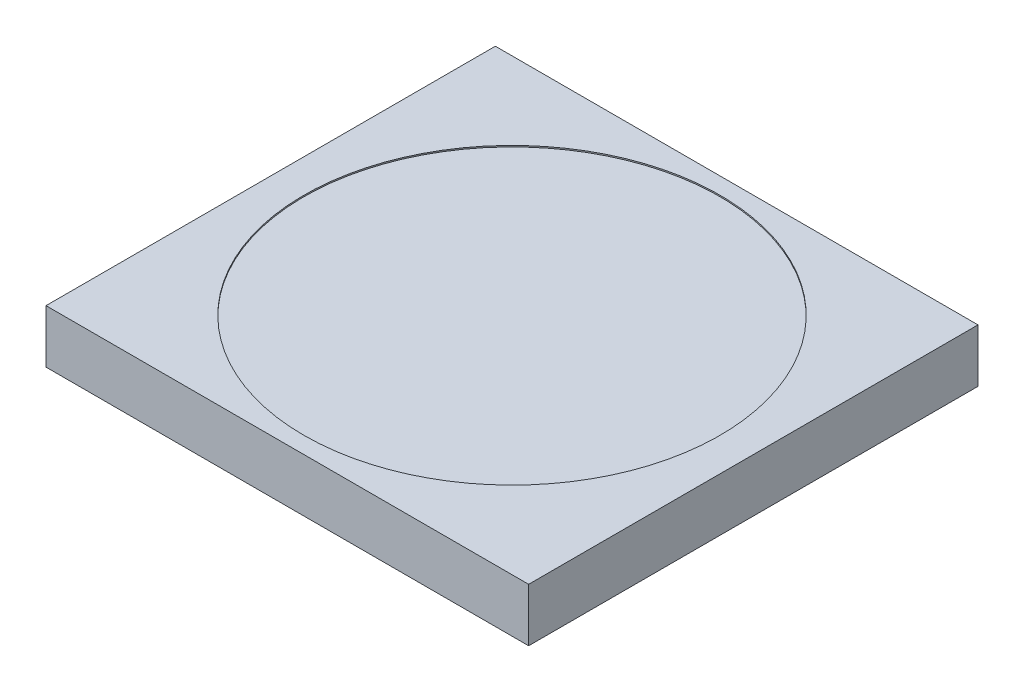
ISO-10303-21;
HEADER;
FILE_DESCRIPTION(('STEP AP214'),'2;1');
FILE_NAME('part.step','',(''),(''),'','','');
FILE_SCHEMA(('AUTOMOTIVE_DESIGN { 1 0 10303 214 1 1 1 1 }'));
ENDSEC;
DATA;
#1=APPLICATION_CONTEXT('core data for automotive mechanical design processes');
#2=APPLICATION_PROTOCOL_DEFINITION('international standard','automotive_design',2000,#1);
#3=PRODUCT_CONTEXT('',#1,'mechanical');
#4=PRODUCT('Part','Part','',(#3));
#5=PRODUCT_RELATED_PRODUCT_CATEGORY('part','',(#4));
#6=PRODUCT_DEFINITION_FORMATION('','',#4);
#7=PRODUCT_DEFINITION_CONTEXT('part definition',#1,'design');
#8=PRODUCT_DEFINITION('design','',#6,#7);
#9=PRODUCT_DEFINITION_SHAPE('','',#8);
#10=(LENGTH_UNIT() NAMED_UNIT(*) SI_UNIT(.MILLI.,.METRE.));
#11=(NAMED_UNIT(*) PLANE_ANGLE_UNIT() SI_UNIT($,.RADIAN.));
#12=(NAMED_UNIT(*) SI_UNIT($,.STERADIAN.) SOLID_ANGLE_UNIT());
#13=UNCERTAINTY_MEASURE_WITH_UNIT(LENGTH_MEASURE(1.E-05),#10,'distance_accuracy_value','');
#14=(GEOMETRIC_REPRESENTATION_CONTEXT(3) GLOBAL_UNCERTAINTY_ASSIGNED_CONTEXT((#13)) GLOBAL_UNIT_ASSIGNED_CONTEXT((#10,
#11,#12)) REPRESENTATION_CONTEXT('',''));
#15=CARTESIAN_POINT('',(0.,0.,0.));
#16=DIRECTION('',(0.,0.,1.));
#17=DIRECTION('',(1.,0.,0.));
#18=AXIS2_PLACEMENT_3D('',#15,#16,#17);
#19=CARTESIAN_POINT('',(145.,16.,-135.));
#20=DIRECTION('',(-1.,0.,0.));
#21=DIRECTION('',(0.,0.,1.));
#22=AXIS2_PLACEMENT_3D('',#19,#20,#21);
#23=PLANE('',#22);
#24=DIRECTION('',(0.,0.,-1.));
#25=VECTOR('',#24,1.);
#26=CARTESIAN_POINT('',(145.,-16.,-135.));
#27=LINE('',#26,#25);
#28=CARTESIAN_POINT('',(145.,-16.,135.));
#29=VERTEX_POINT('',#28);
#30=CARTESIAN_POINT('',(145.,-16.,-135.));
#31=VERTEX_POINT('',#30);
#32=EDGE_CURVE('E111',#29,#31,#27,.T.);
#33=ORIENTED_EDGE('',*,*,#32,.T.);
#34=DIRECTION('',(0.,-1.,0.));
#35=VECTOR('',#34,1.);
#36=CARTESIAN_POINT('',(145.,16.,-135.));
#37=LINE('',#36,#35);
#38=CARTESIAN_POINT('',(145.,16.,-135.));
#39=VERTEX_POINT('',#38);
#40=EDGE_CURVE('E11',#39,#31,#37,.T.);
#41=ORIENTED_EDGE('',*,*,#40,.F.);
#42=DIRECTION('',(0.,0.,-1.));
#43=VECTOR('',#42,1.);
#44=CARTESIAN_POINT('',(145.,16.,-135.));
#45=LINE('',#44,#43);
#46=CARTESIAN_POINT('',(145.,16.,135.));
#47=VERTEX_POINT('',#46);
#48=EDGE_CURVE('E95',#47,#39,#45,.T.);
#49=ORIENTED_EDGE('',*,*,#48,.F.);
#50=DIRECTION('',(0.,-1.,0.));
#51=VECTOR('',#50,1.);
#52=CARTESIAN_POINT('',(145.,16.,135.));
#53=LINE('',#52,#51);
#54=EDGE_CURVE('E107',#47,#29,#53,.T.);
#55=ORIENTED_EDGE('',*,*,#54,.T.);
#56=EDGE_LOOP('',(#33,#41,#49,#55));
#57=FACE_BOUND('',#56,.T.);
#58=ADVANCED_FACE('F43',(#57),#23,.F.);
#59=CARTESIAN_POINT('',(-145.,16.,-135.));
#60=DIRECTION('',(0.,0.,1.));
#61=DIRECTION('',(1.,0.,0.));
#62=AXIS2_PLACEMENT_3D('',#59,#60,#61);
#63=PLANE('',#62);
#64=DIRECTION('',(-1.,0.,0.));
#65=VECTOR('',#64,1.);
#66=CARTESIAN_POINT('',(-145.,-16.,-135.));
#67=LINE('',#66,#65);
#68=CARTESIAN_POINT('',(-145.,-16.,-135.));
#69=VERTEX_POINT('',#68);
#70=EDGE_CURVE('E100',#31,#69,#67,.T.);
#71=ORIENTED_EDGE('',*,*,#70,.T.);
#72=DIRECTION('',(0.,-1.,0.));
#73=VECTOR('',#72,1.);
#74=CARTESIAN_POINT('',(-145.,16.,-135.));
#75=LINE('',#74,#73);
#76=CARTESIAN_POINT('',(-145.,16.,-135.));
#77=VERTEX_POINT('',#76);
#78=EDGE_CURVE('E52',#77,#69,#75,.T.);
#79=ORIENTED_EDGE('',*,*,#78,.F.);
#80=DIRECTION('',(-1.,0.,0.));
#81=VECTOR('',#80,1.);
#82=CARTESIAN_POINT('',(-145.,16.,-135.));
#83=LINE('',#82,#81);
#84=EDGE_CURVE('E90',#39,#77,#83,.T.);
#85=ORIENTED_EDGE('',*,*,#84,.F.);
#86=ORIENTED_EDGE('',*,*,#40,.T.);
#87=EDGE_LOOP('',(#71,#79,#85,#86));
#88=FACE_BOUND('',#87,.T.);
#89=ADVANCED_FACE('F99',(#88),#63,.F.);
#90=CARTESIAN_POINT('',(-145.,16.,-135.));
#91=DIRECTION('',(1.,0.,0.));
#92=DIRECTION('',(0.,0.,-1.));
#93=AXIS2_PLACEMENT_3D('',#90,#91,#92);
#94=PLANE('',#93);
#95=DIRECTION('',(0.,0.,1.));
#96=VECTOR('',#95,1.);
#97=CARTESIAN_POINT('',(-145.,-16.,-135.));
#98=LINE('',#97,#96);
#99=CARTESIAN_POINT('',(-145.,-16.,135.));
#100=VERTEX_POINT('',#99);
#101=EDGE_CURVE('E77',#69,#100,#98,.T.);
#102=ORIENTED_EDGE('',*,*,#101,.T.);
#103=DIRECTION('',(0.,-1.,0.));
#104=VECTOR('',#103,1.);
#105=CARTESIAN_POINT('',(-145.,16.,135.));
#106=LINE('',#105,#104);
#107=CARTESIAN_POINT('',(-145.,16.,135.));
#108=VERTEX_POINT('',#107);
#109=EDGE_CURVE('E102',#108,#100,#106,.T.);
#110=ORIENTED_EDGE('',*,*,#109,.F.);
#111=DIRECTION('',(0.,0.,1.));
#112=VECTOR('',#111,1.);
#113=CARTESIAN_POINT('',(-145.,16.,-135.));
#114=LINE('',#113,#112);
#115=EDGE_CURVE('E93',#77,#108,#114,.T.);
#116=ORIENTED_EDGE('',*,*,#115,.F.);
#117=ORIENTED_EDGE('',*,*,#78,.T.);
#118=EDGE_LOOP('',(#102,#110,#116,#117));
#119=FACE_BOUND('',#118,.T.);
#120=ADVANCED_FACE('F103',(#119),#94,.F.);
#121=CARTESIAN_POINT('',(-145.,16.,135.));
#122=DIRECTION('',(0.,0.,-1.));
#123=DIRECTION('',(-1.,0.,0.));
#124=AXIS2_PLACEMENT_3D('',#121,#122,#123);
#125=PLANE('',#124);
#126=DIRECTION('',(1.,0.,0.));
#127=VECTOR('',#126,1.);
#128=CARTESIAN_POINT('',(-145.,-16.,135.));
#129=LINE('',#128,#127);
#130=EDGE_CURVE('E83',#100,#29,#129,.T.);
#131=ORIENTED_EDGE('',*,*,#130,.T.);
#132=ORIENTED_EDGE('',*,*,#54,.F.);
#133=DIRECTION('',(1.,0.,0.));
#134=VECTOR('',#133,1.);
#135=CARTESIAN_POINT('',(-145.,16.,135.));
#136=LINE('',#135,#134);
#137=EDGE_CURVE('E60',#108,#47,#136,.T.);
#138=ORIENTED_EDGE('',*,*,#137,.F.);
#139=ORIENTED_EDGE('',*,*,#109,.T.);
#140=EDGE_LOOP('',(#131,#132,#138,#139));
#141=FACE_BOUND('',#140,.T.);
#142=ADVANCED_FACE('F125',(#141),#125,.F.);
#143=CARTESIAN_POINT('',(0.,16.,0.));
#144=DIRECTION('',(0.,1.,0.));
#145=DIRECTION('',(0.,0.,1.));
#146=AXIS2_PLACEMENT_3D('',#143,#144,#145);
#147=PLANE('',#146);
#148=CARTESIAN_POINT('',(0.,16.,0.));
#149=DIRECTION('',(0.,1.,0.));
#150=DIRECTION('',(0.,0.,1.));
#151=AXIS2_PLACEMENT_3D('',#148,#149,#150);
#152=CIRCLE('',#151,125.);
#153=CARTESIAN_POINT('',(0.,16.,125.));
#154=VERTEX_POINT('',#153);
#155=EDGE_CURVE('E132',#154,#154,#152,.T.);
#156=ORIENTED_EDGE('',*,*,#155,.F.);
#157=EDGE_LOOP('',(#156));
#158=FACE_BOUND('',#157,.T.);
#159=ORIENTED_EDGE('',*,*,#48,.T.);
#160=ORIENTED_EDGE('',*,*,#84,.T.);
#161=ORIENTED_EDGE('',*,*,#115,.T.);
#162=ORIENTED_EDGE('',*,*,#137,.T.);
#163=EDGE_LOOP('',(#159,#160,#161,#162));
#164=FACE_BOUND('',#163,.T.);
#165=ADVANCED_FACE('F91',(#158,#164),#147,.T.);
#166=CARTESIAN_POINT('',(0.,-16.,0.));
#167=DIRECTION('',(0.,1.,0.));
#168=DIRECTION('',(0.,0.,1.));
#169=AXIS2_PLACEMENT_3D('',#166,#167,#168);
#170=PLANE('',#169);
#171=ORIENTED_EDGE('',*,*,#32,.F.);
#172=ORIENTED_EDGE('',*,*,#130,.F.);
#173=ORIENTED_EDGE('',*,*,#101,.F.);
#174=ORIENTED_EDGE('',*,*,#70,.F.);
#175=EDGE_LOOP('',(#171,#172,#173,#174));
#176=FACE_BOUND('',#175,.T.);
#177=ADVANCED_FACE('F128',(#176),#170,.F.);
#178=CARTESIAN_POINT('',(0.,15.2,0.));
#179=DIRECTION('',(0.,1.,0.));
#180=DIRECTION('',(0.,0.,1.));
#181=AXIS2_PLACEMENT_3D('',#178,#179,#180);
#182=CYLINDRICAL_SURFACE('',#181,125.);
#183=CARTESIAN_POINT('',(0.,15.2,0.));
#184=DIRECTION('',(0.,1.,0.));
#185=DIRECTION('',(0.,0.,1.));
#186=AXIS2_PLACEMENT_3D('',#183,#184,#185);
#187=CIRCLE('',#186,125.);
#188=CARTESIAN_POINT('',(0.,15.2,125.));
#189=VERTEX_POINT('',#188);
#190=EDGE_CURVE('E115',#189,#189,#187,.T.);
#191=ORIENTED_EDGE('',*,*,#190,.F.);
#192=EDGE_LOOP('',(#191));
#193=FACE_BOUND('',#192,.T.);
#194=ORIENTED_EDGE('',*,*,#155,.T.);
#195=EDGE_LOOP('',(#194));
#196=FACE_BOUND('',#195,.T.);
#197=ADVANCED_FACE('F142',(#193,#196),#182,.F.);
#198=CARTESIAN_POINT('',(0.,15.2,0.));
#199=DIRECTION('',(0.,1.,0.));
#200=DIRECTION('',(0.,0.,1.));
#201=AXIS2_PLACEMENT_3D('',#198,#199,#200);
#202=PLANE('',#201);
#203=ORIENTED_EDGE('',*,*,#190,.T.);
#204=EDGE_LOOP('',(#203));
#205=FACE_BOUND('',#204,.T.);
#206=ADVANCED_FACE('F140',(#205),#202,.T.);
#207=CLOSED_SHELL('',(#58,#89,#120,#142,#165,#177,#197,#206));
#208=MANIFOLD_SOLID_BREP('B2',#207);
#209=ADVANCED_BREP_SHAPE_REPRESENTATION('',(#18,#208),#14);
#210=SHAPE_DEFINITION_REPRESENTATION(#9,#209);
ENDSEC;
END-ISO-10303-21;
